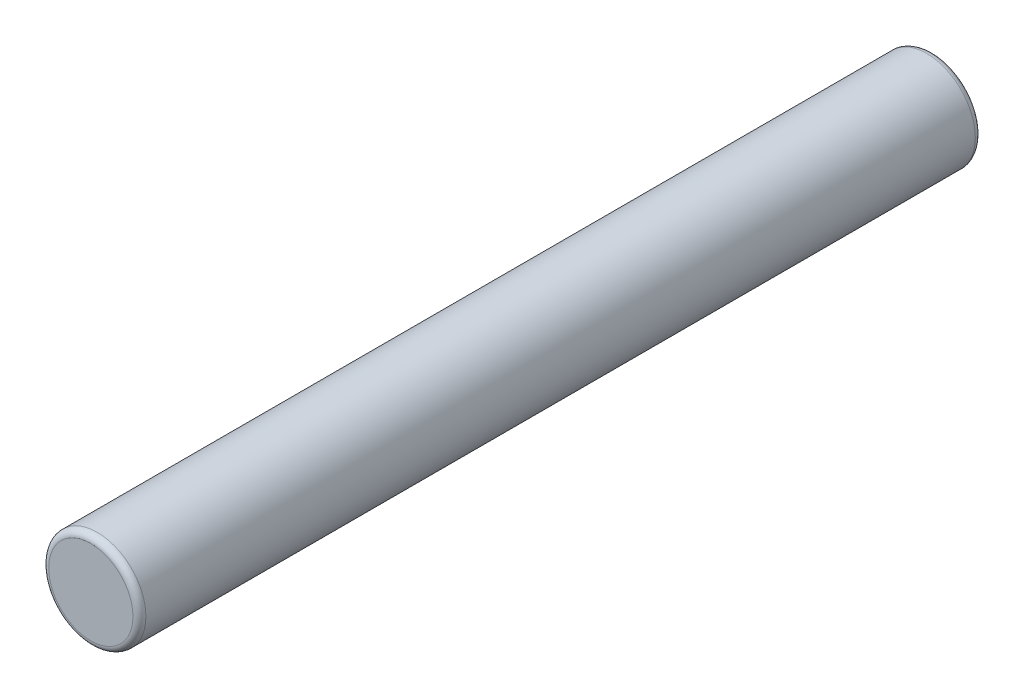
ISO-10303-21;
HEADER;
FILE_DESCRIPTION(('STEP AP214'),'2;1');
FILE_NAME('part.step','',(''),(''),'','','');
FILE_SCHEMA(('AUTOMOTIVE_DESIGN { 1 0 10303 214 1 1 1 1 }'));
ENDSEC;
DATA;
#1=APPLICATION_CONTEXT('core data for automotive mechanical design processes');
#2=APPLICATION_PROTOCOL_DEFINITION('international standard','automotive_design',2000,#1);
#3=PRODUCT_CONTEXT('',#1,'mechanical');
#4=PRODUCT('Part','Part','',(#3));
#5=PRODUCT_RELATED_PRODUCT_CATEGORY('part','',(#4));
#6=PRODUCT_DEFINITION_FORMATION('','',#4);
#7=PRODUCT_DEFINITION_CONTEXT('part definition',#1,'design');
#8=PRODUCT_DEFINITION('design','',#6,#7);
#9=PRODUCT_DEFINITION_SHAPE('','',#8);
#10=(LENGTH_UNIT() NAMED_UNIT(*) SI_UNIT(.MILLI.,.METRE.));
#11=(NAMED_UNIT(*) PLANE_ANGLE_UNIT() SI_UNIT($,.RADIAN.));
#12=(NAMED_UNIT(*) SI_UNIT($,.STERADIAN.) SOLID_ANGLE_UNIT());
#13=UNCERTAINTY_MEASURE_WITH_UNIT(LENGTH_MEASURE(1.E-05),#10,'distance_accuracy_value','');
#14=(GEOMETRIC_REPRESENTATION_CONTEXT(3) GLOBAL_UNCERTAINTY_ASSIGNED_CONTEXT((#13)) GLOBAL_UNIT_ASSIGNED_CONTEXT((#10,
#11,#12)) REPRESENTATION_CONTEXT('',''));
#15=CARTESIAN_POINT('',(0.,0.,0.));
#16=DIRECTION('',(0.,0.,1.));
#17=DIRECTION('',(1.,0.,0.));
#18=AXIS2_PLACEMENT_3D('',#15,#16,#17);
#19=CARTESIAN_POINT('',(0.,0.,26.));
#20=DIRECTION('',(0.,0.,-1.));
#21=DIRECTION('',(-1.,0.,0.));
#22=AXIS2_PLACEMENT_3D('',#19,#20,#21);
#23=CYLINDRICAL_SURFACE('',#22,1.5);
#24=CARTESIAN_POINT('',(0.,0.,0.199999999999999));
#25=DIRECTION('',(0.,0.,1.));
#26=DIRECTION('',(1.,0.,0.));
#27=AXIS2_PLACEMENT_3D('',#24,#25,#26);
#28=CIRCLE('',#27,1.5);
#29=CARTESIAN_POINT('',(-1.5,0.,0.199999999999999));
#30=VERTEX_POINT('',#29);
#31=EDGE_CURVE('E42',#30,#30,#28,.T.);
#32=CARTESIAN_POINT('',(0.,0.,25.8));
#33=DIRECTION('',(0.,0.,1.));
#34=DIRECTION('',(1.,0.,0.));
#35=AXIS2_PLACEMENT_3D('',#32,#33,#34);
#36=CIRCLE('',#35,1.5);
#37=CARTESIAN_POINT('',(-1.5,0.,25.8));
#38=VERTEX_POINT('',#37);
#39=EDGE_CURVE('E46',#38,#38,#36,.F.);
#40=CARTESIAN_POINT('',(-1.5,0.,0.199999999999999));
#41=CARTESIAN_POINT('',(-1.5,0.,0.466666666666665));
#42=CARTESIAN_POINT('',(-1.5,0.,0.733333333333331));
#43=CARTESIAN_POINT('',(-1.5,0.,1.26666666666666));
#44=CARTESIAN_POINT('',(-1.5,0.,1.53333333333333));
#45=CARTESIAN_POINT('',(-1.5,0.,2.06666666666667));
#46=CARTESIAN_POINT('',(-1.5,0.,2.33333333333333));
#47=CARTESIAN_POINT('',(-1.5,0.,2.86666666666667));
#48=CARTESIAN_POINT('',(-1.5,0.,3.13333333333333));
#49=CARTESIAN_POINT('',(-1.5,0.,3.66666666666667));
#50=CARTESIAN_POINT('',(-1.5,0.,3.93333333333333));
#51=CARTESIAN_POINT('',(-1.5,0.,4.46666666666667));
#52=CARTESIAN_POINT('',(-1.5,0.,4.73333333333333));
#53=CARTESIAN_POINT('',(-1.5,0.,5.26666666666666));
#54=CARTESIAN_POINT('',(-1.5,0.,5.53333333333333));
#55=CARTESIAN_POINT('',(-1.5,0.,6.06666666666667));
#56=CARTESIAN_POINT('',(-1.5,0.,6.33333333333333));
#57=CARTESIAN_POINT('',(-1.5,0.,6.86666666666667));
#58=CARTESIAN_POINT('',(-1.5,0.,7.13333333333333));
#59=CARTESIAN_POINT('',(-1.5,0.,7.66666666666667));
#60=CARTESIAN_POINT('',(-1.5,0.,7.93333333333333));
#61=CARTESIAN_POINT('',(-1.5,0.,8.46666666666667));
#62=CARTESIAN_POINT('',(-1.5,0.,8.73333333333333));
#63=CARTESIAN_POINT('',(-1.5,0.,9.26666666666667));
#64=CARTESIAN_POINT('',(-1.5,0.,9.53333333333333));
#65=CARTESIAN_POINT('',(-1.5,0.,10.0666666666667));
#66=CARTESIAN_POINT('',(-1.5,0.,10.3333333333333));
#67=CARTESIAN_POINT('',(-1.5,0.,10.8666666666667));
#68=CARTESIAN_POINT('',(-1.5,0.,11.1333333333333));
#69=CARTESIAN_POINT('',(-1.5,0.,11.6666666666667));
#70=CARTESIAN_POINT('',(-1.5,0.,11.9333333333333));
#71=CARTESIAN_POINT('',(-1.5,0.,12.4666666666667));
#72=CARTESIAN_POINT('',(-1.5,0.,12.7333333333333));
#73=CARTESIAN_POINT('',(-1.5,0.,13.2666666666667));
#74=CARTESIAN_POINT('',(-1.5,0.,13.5333333333333));
#75=CARTESIAN_POINT('',(-1.5,0.,14.0666666666667));
#76=CARTESIAN_POINT('',(-1.5,0.,14.3333333333333));
#77=CARTESIAN_POINT('',(-1.5,0.,14.8666666666667));
#78=CARTESIAN_POINT('',(-1.5,0.,15.1333333333333));
#79=CARTESIAN_POINT('',(-1.5,0.,15.6666666666667));
#80=CARTESIAN_POINT('',(-1.5,0.,15.9333333333333));
#81=CARTESIAN_POINT('',(-1.5,0.,16.4666666666667));
#82=CARTESIAN_POINT('',(-1.5,0.,16.7333333333333));
#83=CARTESIAN_POINT('',(-1.5,0.,17.2666666666667));
#84=CARTESIAN_POINT('',(-1.5,0.,17.5333333333333));
#85=CARTESIAN_POINT('',(-1.5,0.,18.0666666666667));
#86=CARTESIAN_POINT('',(-1.5,0.,18.3333333333333));
#87=CARTESIAN_POINT('',(-1.5,0.,18.8666666666667));
#88=CARTESIAN_POINT('',(-1.5,0.,19.1333333333333));
#89=CARTESIAN_POINT('',(-1.5,0.,19.6666666666667));
#90=CARTESIAN_POINT('',(-1.5,0.,19.9333333333333));
#91=CARTESIAN_POINT('',(-1.5,0.,20.4666666666667));
#92=CARTESIAN_POINT('',(-1.5,0.,20.7333333333333));
#93=CARTESIAN_POINT('',(-1.5,0.,21.2666666666667));
#94=CARTESIAN_POINT('',(-1.5,0.,21.5333333333333));
#95=CARTESIAN_POINT('',(-1.5,0.,22.0666666666667));
#96=CARTESIAN_POINT('',(-1.5,0.,22.3333333333333));
#97=CARTESIAN_POINT('',(-1.5,0.,22.8666666666667));
#98=CARTESIAN_POINT('',(-1.5,0.,23.1333333333333));
#99=CARTESIAN_POINT('',(-1.5,0.,23.6666666666667));
#100=CARTESIAN_POINT('',(-1.5,0.,23.9333333333333));
#101=CARTESIAN_POINT('',(-1.5,0.,24.4666666666667));
#102=CARTESIAN_POINT('',(-1.5,0.,24.7333333333333));
#103=CARTESIAN_POINT('',(-1.5,0.,25.2666666666667));
#104=CARTESIAN_POINT('',(-1.5,0.,25.5333333333333));
#105=CARTESIAN_POINT('',(-1.5,0.,25.8));
#106=B_SPLINE_CURVE_WITH_KNOTS('',3,(#40,#41,#42,#43,#44,#45,#46,#47,#48,#49,#50,#51,#52,#53,
#54,#55,#56,#57,#58,#59,#60,#61,#62,#63,#64,#65,#66,#67,#68,#69,#70,#71,#72,#73,#74,#75,#76,#77,
#78,#79,#80,#81,#82,#83,#84,#85,#86,#87,#88,#89,#90,#91,#92,#93,#94,#95,#96,#97,#98,#99,#100,
#101,#102,#103,#104,#105),.UNSPECIFIED.,.F.,.F.,(4,2,2,2,2,2,2,2,2,2,2,2,2,2,2,2,2,2,2,2,2,2,2,
2,2,2,2,2,2,2,2,2,4),(0.,0.799999999999999,1.6,2.4,3.2,4.,4.8,5.6,6.4,7.2,8.,8.8,9.6,10.4,11.2,
12.,12.8,13.6,14.4,15.2,16.,16.8,17.6,18.4,19.2,20.,20.8,21.6,22.4,23.2,24.,24.8,25.6),.UNSPECIFIED.);
#107=EDGE_CURVE('BSEAM31',#30,#38,#106,.T.);
#108=ORIENTED_EDGE('',*,*,#31,.T.);
#109=ORIENTED_EDGE('',*,*,#39,.T.);
#110=ORIENTED_EDGE('',*,*,#107,.T.);
#111=ORIENTED_EDGE('',*,*,#107,.F.);
#112=EDGE_LOOP('',(#108,#110,#109,#111));
#113=FACE_BOUND('',#112,.T.);
#114=ADVANCED_FACE('F31',(#113),#23,.T.);
#115=CARTESIAN_POINT('',(0.,0.,26.));
#116=DIRECTION('',(0.,0.,1.));
#117=DIRECTION('',(1.,0.,0.));
#118=AXIS2_PLACEMENT_3D('',#115,#116,#117);
#119=PLANE('',#118);
#120=CARTESIAN_POINT('',(0.,0.,26.));
#121=DIRECTION('',(0.,0.,1.));
#122=DIRECTION('',(1.,0.,0.));
#123=AXIS2_PLACEMENT_3D('',#120,#121,#122);
#124=CIRCLE('',#123,1.3);
#125=CARTESIAN_POINT('',(1.3,0.,26.));
#126=VERTEX_POINT('',#125);
#127=EDGE_CURVE('E10',#126,#126,#124,.T.);
#128=ORIENTED_EDGE('',*,*,#127,.T.);
#129=EDGE_LOOP('',(#128));
#130=FACE_BOUND('',#129,.T.);
#131=ADVANCED_FACE('F62',(#130),#119,.T.);
#132=CARTESIAN_POINT('',(0.,0.,0.));
#133=DIRECTION('',(0.,0.,1.));
#134=DIRECTION('',(1.,0.,0.));
#135=AXIS2_PLACEMENT_3D('',#132,#133,#134);
#136=PLANE('',#135);
#137=CARTESIAN_POINT('',(0.,0.,0.));
#138=DIRECTION('',(0.,0.,1.));
#139=DIRECTION('',(1.,0.,0.));
#140=AXIS2_PLACEMENT_3D('',#137,#138,#139);
#141=CIRCLE('',#140,1.3);
#142=CARTESIAN_POINT('',(1.3,0.,0.));
#143=VERTEX_POINT('',#142);
#144=EDGE_CURVE('E38',#143,#143,#141,.F.);
#145=ORIENTED_EDGE('',*,*,#144,.T.);
#146=EDGE_LOOP('',(#145));
#147=FACE_BOUND('',#146,.T.);
#148=ADVANCED_FACE('F59',(#147),#136,.F.);
#149=CARTESIAN_POINT('',(0.,0.,0.199999999999999));
#150=DIRECTION('',(0.,0.,1.));
#151=DIRECTION('',(1.,0.,0.));
#152=AXIS2_PLACEMENT_3D('',#149,#150,#151);
#153=TOROIDAL_SURFACE('',#152,1.3,0.2);
#154=ORIENTED_EDGE('',*,*,#144,.F.);
#155=EDGE_LOOP('',(#154));
#156=FACE_BOUND('',#155,.T.);
#157=ORIENTED_EDGE('',*,*,#31,.F.);
#158=EDGE_LOOP('',(#157));
#159=FACE_BOUND('',#158,.T.);
#160=ADVANCED_FACE('F55',(#156,#159),#153,.T.);
#161=CARTESIAN_POINT('',(0.,0.,25.8));
#162=DIRECTION('',(0.,0.,1.));
#163=DIRECTION('',(1.,0.,0.));
#164=AXIS2_PLACEMENT_3D('',#161,#162,#163);
#165=TOROIDAL_SURFACE('',#164,1.3,0.2);
#166=ORIENTED_EDGE('',*,*,#39,.F.);
#167=EDGE_LOOP('',(#166));
#168=FACE_BOUND('',#167,.T.);
#169=ORIENTED_EDGE('',*,*,#127,.F.);
#170=EDGE_LOOP('',(#169));
#171=FACE_BOUND('',#170,.T.);
#172=ADVANCED_FACE('F33',(#168,#171),#165,.T.);
#173=CLOSED_SHELL('',(#114,#131,#148,#160,#172));
#174=MANIFOLD_SOLID_BREP('B2',#173);
#175=ADVANCED_BREP_SHAPE_REPRESENTATION('',(#18,#174),#14);
#176=SHAPE_DEFINITION_REPRESENTATION(#9,#175);
ENDSEC;
END-ISO-10303-21;
